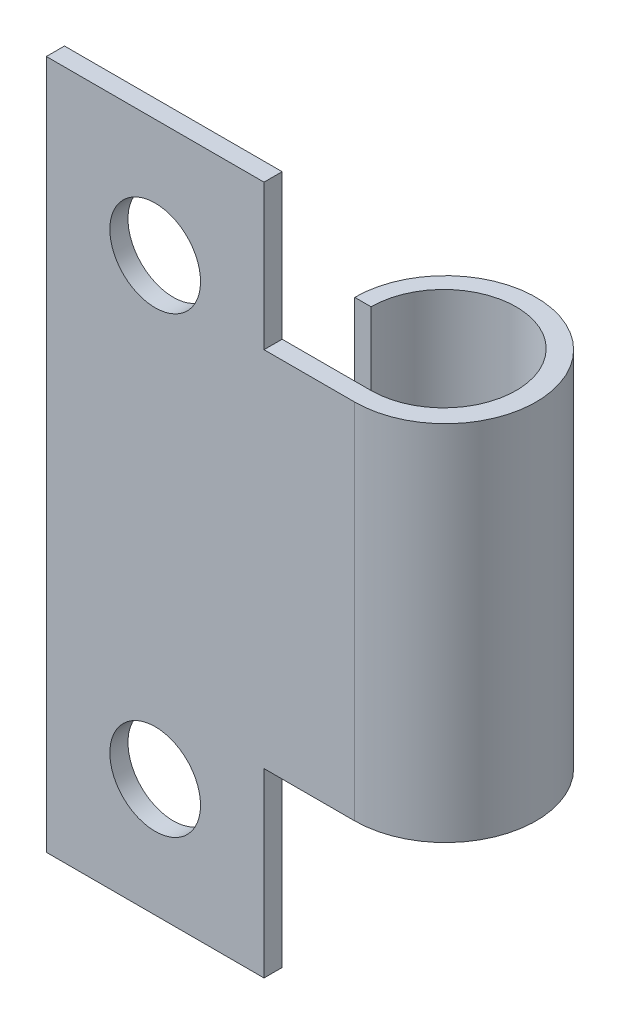
ISO-10303-21;
HEADER;
FILE_DESCRIPTION(('STEP AP214'),'2;1');
FILE_NAME('part.step','',(''),(''),'','','');
FILE_SCHEMA(('AUTOMOTIVE_DESIGN { 1 0 10303 214 1 1 1 1 }'));
ENDSEC;
DATA;
#1=APPLICATION_CONTEXT('core data for automotive mechanical design processes');
#2=APPLICATION_PROTOCOL_DEFINITION('international standard','automotive_design',2000,#1);
#3=PRODUCT_CONTEXT('',#1,'mechanical');
#4=PRODUCT('Part','Part','',(#3));
#5=PRODUCT_RELATED_PRODUCT_CATEGORY('part','',(#4));
#6=PRODUCT_DEFINITION_FORMATION('','',#4);
#7=PRODUCT_DEFINITION_CONTEXT('part definition',#1,'design');
#8=PRODUCT_DEFINITION('design','',#6,#7);
#9=PRODUCT_DEFINITION_SHAPE('','',#8);
#10=(LENGTH_UNIT() NAMED_UNIT(*) SI_UNIT(.MILLI.,.METRE.));
#11=(NAMED_UNIT(*) PLANE_ANGLE_UNIT() SI_UNIT($,.RADIAN.));
#12=(NAMED_UNIT(*) SI_UNIT($,.STERADIAN.) SOLID_ANGLE_UNIT());
#13=UNCERTAINTY_MEASURE_WITH_UNIT(LENGTH_MEASURE(1.E-05),#10,'distance_accuracy_value','');
#14=(GEOMETRIC_REPRESENTATION_CONTEXT(3) GLOBAL_UNCERTAINTY_ASSIGNED_CONTEXT((#13)) GLOBAL_UNIT_ASSIGNED_CONTEXT((#10,
#11,#12)) REPRESENTATION_CONTEXT('',''));
#15=CARTESIAN_POINT('',(0.,0.,0.));
#16=DIRECTION('',(0.,0.,1.));
#17=DIRECTION('',(1.,0.,0.));
#18=AXIS2_PLACEMENT_3D('',#15,#16,#17);
#19=CARTESIAN_POINT('',(12.,0.,1.));
#20=DIRECTION('',(-1.,0.,0.));
#21=DIRECTION('',(0.,0.,1.));
#22=AXIS2_PLACEMENT_3D('',#19,#20,#21);
#23=PLANE('',#22);
#24=DIRECTION('',(0.,0.,1.));
#25=VECTOR('',#24,1.);
#26=CARTESIAN_POINT('',(12.,10.,0.));
#27=LINE('',#26,#25);
#28=CARTESIAN_POINT('',(12.,10.,0.));
#29=VERTEX_POINT('',#28);
#30=CARTESIAN_POINT('',(12.,10.,1.));
#31=VERTEX_POINT('',#30);
#32=EDGE_CURVE('E123',#29,#31,#27,.T.);
#33=ORIENTED_EDGE('',*,*,#32,.T.);
#34=DIRECTION('',(0.,1.,0.));
#35=VECTOR('',#34,1.);
#36=CARTESIAN_POINT('',(12.,0.,1.));
#37=LINE('',#36,#35);
#38=CARTESIAN_POINT('',(12.,0.,1.));
#39=VERTEX_POINT('',#38);
#40=EDGE_CURVE('E173',#39,#31,#37,.T.);
#41=ORIENTED_EDGE('',*,*,#40,.F.);
#42=DIRECTION('',(0.,0.,-1.));
#43=VECTOR('',#42,1.);
#44=CARTESIAN_POINT('',(12.,0.,1.));
#45=LINE('',#44,#43);
#46=CARTESIAN_POINT('',(12.,0.,0.));
#47=VERTEX_POINT('',#46);
#48=EDGE_CURVE('E43',#39,#47,#45,.T.);
#49=ORIENTED_EDGE('',*,*,#48,.T.);
#50=DIRECTION('',(0.,1.,0.));
#51=VECTOR('',#50,1.);
#52=CARTESIAN_POINT('',(12.,0.,0.));
#53=LINE('',#52,#51);
#54=EDGE_CURVE('E142',#47,#29,#53,.T.);
#55=ORIENTED_EDGE('',*,*,#54,.T.);
#56=EDGE_LOOP('',(#33,#41,#49,#55));
#57=FACE_BOUND('',#56,.T.);
#58=ADVANCED_FACE('F35',(#57),#23,.F.);
#59=CARTESIAN_POINT('',(0.,0.,1.));
#60=DIRECTION('',(0.,0.,-1.));
#61=DIRECTION('',(-1.,0.,0.));
#62=AXIS2_PLACEMENT_3D('',#59,#60,#61);
#63=PLANE('',#62);
#64=DIRECTION('',(0.,-1.,0.));
#65=VECTOR('',#64,1.);
#66=CARTESIAN_POINT('',(0.,0.,1.));
#67=LINE('',#66,#65);
#68=CARTESIAN_POINT('',(0.,38.,1.));
#69=VERTEX_POINT('',#68);
#70=CARTESIAN_POINT('',(0.,0.,1.));
#71=VERTEX_POINT('',#70);
#72=EDGE_CURVE('E149',#69,#71,#67,.T.);
#73=ORIENTED_EDGE('',*,*,#72,.T.);
#74=DIRECTION('',(1.,0.,0.));
#75=VECTOR('',#74,1.);
#76=CARTESIAN_POINT('',(0.,0.,1.));
#77=LINE('',#76,#75);
#78=EDGE_CURVE('E87',#71,#39,#77,.T.);
#79=ORIENTED_EDGE('',*,*,#78,.T.);
#80=ORIENTED_EDGE('',*,*,#40,.T.);
#81=DIRECTION('',(1.,0.,0.));
#82=VECTOR('',#81,1.);
#83=CARTESIAN_POINT('',(12.,10.,1.));
#84=LINE('',#83,#82);
#85=CARTESIAN_POINT('',(17.,10.,1.));
#86=VERTEX_POINT('',#85);
#87=EDGE_CURVE('E131',#31,#86,#84,.T.);
#88=ORIENTED_EDGE('',*,*,#87,.T.);
#89=DIRECTION('',(0.,1.,0.));
#90=VECTOR('',#89,1.);
#91=CARTESIAN_POINT('',(17.,10.,1.));
#92=LINE('',#91,#90);
#93=CARTESIAN_POINT('',(17.,30.,1.));
#94=VERTEX_POINT('',#93);
#95=EDGE_CURVE('E186',#86,#94,#92,.T.);
#96=ORIENTED_EDGE('',*,*,#95,.T.);
#97=DIRECTION('',(1.,0.,0.));
#98=VECTOR('',#97,1.);
#99=CARTESIAN_POINT('',(12.,30.,1.));
#100=LINE('',#99,#98);
#101=CARTESIAN_POINT('',(12.,30.,1.));
#102=VERTEX_POINT('',#101);
#103=EDGE_CURVE('E201',#102,#94,#100,.T.);
#104=ORIENTED_EDGE('',*,*,#103,.F.);
#105=CARTESIAN_POINT('',(12.,38.,1.));
#106=VERTEX_POINT('',#105);
#107=EDGE_CURVE('E175',#102,#106,#37,.T.);
#108=ORIENTED_EDGE('',*,*,#107,.T.);
#109=DIRECTION('',(-1.,0.,0.));
#110=VECTOR('',#109,1.);
#111=CARTESIAN_POINT('',(0.,38.,1.));
#112=LINE('',#111,#110);
#113=EDGE_CURVE('E59',#106,#69,#112,.T.);
#114=ORIENTED_EDGE('',*,*,#113,.T.);
#115=EDGE_LOOP('',(#73,#79,#80,#88,#96,#104,#108,#114));
#116=FACE_BOUND('',#115,.T.);
#117=CARTESIAN_POINT('',(6.,31.5,1.));
#118=DIRECTION('',(0.,0.,1.));
#119=DIRECTION('',(1.,0.,0.));
#120=AXIS2_PLACEMENT_3D('',#117,#118,#119);
#121=CIRCLE('',#120,2.5);
#122=CARTESIAN_POINT('',(8.5,31.5,1.));
#123=VERTEX_POINT('',#122);
#124=EDGE_CURVE('E167',#123,#123,#121,.T.);
#125=ORIENTED_EDGE('',*,*,#124,.F.);
#126=EDGE_LOOP('',(#125));
#127=FACE_BOUND('',#126,.T.);
#128=CARTESIAN_POINT('',(6.,6.5,1.));
#129=DIRECTION('',(0.,0.,1.));
#130=DIRECTION('',(1.,0.,0.));
#131=AXIS2_PLACEMENT_3D('',#128,#129,#130);
#132=CIRCLE('',#131,2.5);
#133=CARTESIAN_POINT('',(8.5,6.5,1.));
#134=VERTEX_POINT('',#133);
#135=EDGE_CURVE('E179',#134,#134,#132,.T.);
#136=ORIENTED_EDGE('',*,*,#135,.F.);
#137=EDGE_LOOP('',(#136));
#138=FACE_BOUND('',#137,.T.);
#139=ADVANCED_FACE('F214',(#116,#127,#138),#63,.F.);
#140=CARTESIAN_POINT('',(0.,0.,0.));
#141=DIRECTION('',(0.,0.,-1.));
#142=DIRECTION('',(-1.,0.,0.));
#143=AXIS2_PLACEMENT_3D('',#140,#141,#142);
#144=PLANE('',#143);
#145=CARTESIAN_POINT('',(6.,31.5,0.));
#146=DIRECTION('',(0.,0.,1.));
#147=DIRECTION('',(1.,0.,0.));
#148=AXIS2_PLACEMENT_3D('',#145,#146,#147);
#149=CIRCLE('',#148,2.5);
#150=CARTESIAN_POINT('',(8.5,31.5,0.));
#151=VERTEX_POINT('',#150);
#152=EDGE_CURVE('E169',#151,#151,#149,.T.);
#153=ORIENTED_EDGE('',*,*,#152,.T.);
#154=EDGE_LOOP('',(#153));
#155=FACE_BOUND('',#154,.T.);
#156=DIRECTION('',(0.,-1.,0.));
#157=VECTOR('',#156,1.);
#158=CARTESIAN_POINT('',(0.,0.,0.));
#159=LINE('',#158,#157);
#160=CARTESIAN_POINT('',(0.,38.,0.));
#161=VERTEX_POINT('',#160);
#162=CARTESIAN_POINT('',(0.,0.,0.));
#163=VERTEX_POINT('',#162);
#164=EDGE_CURVE('E164',#161,#163,#159,.T.);
#165=ORIENTED_EDGE('',*,*,#164,.F.);
#166=DIRECTION('',(-1.,0.,0.));
#167=VECTOR('',#166,1.);
#168=CARTESIAN_POINT('',(0.,38.,0.));
#169=LINE('',#168,#167);
#170=CARTESIAN_POINT('',(12.,38.,0.));
#171=VERTEX_POINT('',#170);
#172=EDGE_CURVE('E80',#171,#161,#169,.T.);
#173=ORIENTED_EDGE('',*,*,#172,.F.);
#174=CARTESIAN_POINT('',(12.,30.,0.));
#175=VERTEX_POINT('',#174);
#176=EDGE_CURVE('E147',#175,#171,#53,.T.);
#177=ORIENTED_EDGE('',*,*,#176,.F.);
#178=DIRECTION('',(-1.,0.,0.));
#179=VECTOR('',#178,1.);
#180=CARTESIAN_POINT('',(16.9027685867457,30.,0.));
#181=LINE('',#180,#179);
#182=CARTESIAN_POINT('',(16.9027685867457,30.,0.));
#183=VERTEX_POINT('',#182);
#184=EDGE_CURVE('E50',#183,#175,#181,.T.);
#185=ORIENTED_EDGE('',*,*,#184,.F.);
#186=DIRECTION('',(0.,1.,0.));
#187=VECTOR('',#186,1.);
#188=CARTESIAN_POINT('',(16.9027685867457,10.,0.));
#189=LINE('',#188,#187);
#190=CARTESIAN_POINT('',(16.9027685867457,10.,0.));
#191=VERTEX_POINT('',#190);
#192=EDGE_CURVE('E143',#191,#183,#189,.T.);
#193=ORIENTED_EDGE('',*,*,#192,.F.);
#194=DIRECTION('',(-1.,0.,0.));
#195=VECTOR('',#194,1.);
#196=CARTESIAN_POINT('',(16.9027685867457,10.,0.));
#197=LINE('',#196,#195);
#198=EDGE_CURVE('E127',#191,#29,#197,.T.);
#199=ORIENTED_EDGE('',*,*,#198,.T.);
#200=ORIENTED_EDGE('',*,*,#54,.F.);
#201=DIRECTION('',(1.,0.,0.));
#202=VECTOR('',#201,1.);
#203=CARTESIAN_POINT('',(0.,0.,0.));
#204=LINE('',#203,#202);
#205=EDGE_CURVE('E151',#163,#47,#204,.T.);
#206=ORIENTED_EDGE('',*,*,#205,.F.);
#207=EDGE_LOOP('',(#165,#173,#177,#185,#193,#199,#200,#206));
#208=FACE_BOUND('',#207,.T.);
#209=CARTESIAN_POINT('',(6.,6.5,0.));
#210=DIRECTION('',(0.,0.,1.));
#211=DIRECTION('',(1.,0.,0.));
#212=AXIS2_PLACEMENT_3D('',#209,#210,#211);
#213=CIRCLE('',#212,2.5);
#214=CARTESIAN_POINT('',(8.5,6.5,0.));
#215=VERTEX_POINT('',#214);
#216=EDGE_CURVE('E181',#215,#215,#213,.T.);
#217=ORIENTED_EDGE('',*,*,#216,.T.);
#218=EDGE_LOOP('',(#217));
#219=FACE_BOUND('',#218,.T.);
#220=ADVANCED_FACE('F140',(#155,#208,#219),#144,.T.);
#221=CARTESIAN_POINT('',(0.,0.,1.));
#222=DIRECTION('',(1.,0.,0.));
#223=DIRECTION('',(0.,0.,-1.));
#224=AXIS2_PLACEMENT_3D('',#221,#222,#223);
#225=PLANE('',#224);
#226=ORIENTED_EDGE('',*,*,#164,.T.);
#227=DIRECTION('',(0.,0.,-1.));
#228=VECTOR('',#227,1.);
#229=CARTESIAN_POINT('',(0.,0.,1.));
#230=LINE('',#229,#228);
#231=EDGE_CURVE('E11',#71,#163,#230,.T.);
#232=ORIENTED_EDGE('',*,*,#231,.F.);
#233=ORIENTED_EDGE('',*,*,#72,.F.);
#234=DIRECTION('',(0.,0.,-1.));
#235=VECTOR('',#234,1.);
#236=CARTESIAN_POINT('',(0.,38.,1.));
#237=LINE('',#236,#235);
#238=EDGE_CURVE('E155',#69,#161,#237,.T.);
#239=ORIENTED_EDGE('',*,*,#238,.T.);
#240=EDGE_LOOP('',(#226,#232,#233,#239));
#241=FACE_BOUND('',#240,.T.);
#242=ADVANCED_FACE('F37',(#241),#225,.F.);
#243=CARTESIAN_POINT('',(0.,0.,1.));
#244=DIRECTION('',(0.,1.,0.));
#245=DIRECTION('',(0.,0.,1.));
#246=AXIS2_PLACEMENT_3D('',#243,#244,#245);
#247=PLANE('',#246);
#248=ORIENTED_EDGE('',*,*,#205,.T.);
#249=ORIENTED_EDGE('',*,*,#48,.F.);
#250=ORIENTED_EDGE('',*,*,#78,.F.);
#251=ORIENTED_EDGE('',*,*,#231,.T.);
#252=EDGE_LOOP('',(#248,#249,#250,#251));
#253=FACE_BOUND('',#252,.T.);
#254=ADVANCED_FACE('F218',(#253),#247,.F.);
#255=ORIENTED_EDGE('',*,*,#107,.F.);
#256=DIRECTION('',(0.,0.,1.));
#257=VECTOR('',#256,1.);
#258=CARTESIAN_POINT('',(12.,30.,0.));
#259=LINE('',#258,#257);
#260=EDGE_CURVE('E204',#175,#102,#259,.T.);
#261=ORIENTED_EDGE('',*,*,#260,.F.);
#262=ORIENTED_EDGE('',*,*,#176,.T.);
#263=DIRECTION('',(0.,0.,-1.));
#264=VECTOR('',#263,1.);
#265=CARTESIAN_POINT('',(12.,38.,1.));
#266=LINE('',#265,#264);
#267=EDGE_CURVE('E157',#106,#171,#266,.T.);
#268=ORIENTED_EDGE('',*,*,#267,.F.);
#269=EDGE_LOOP('',(#255,#261,#262,#268));
#270=FACE_BOUND('',#269,.T.);
#271=ADVANCED_FACE('F224',(#270),#23,.F.);
#272=CARTESIAN_POINT('',(0.,38.,1.));
#273=DIRECTION('',(0.,-1.,0.));
#274=DIRECTION('',(0.,0.,-1.));
#275=AXIS2_PLACEMENT_3D('',#272,#273,#274);
#276=PLANE('',#275);
#277=ORIENTED_EDGE('',*,*,#172,.T.);
#278=ORIENTED_EDGE('',*,*,#238,.F.);
#279=ORIENTED_EDGE('',*,*,#113,.F.);
#280=ORIENTED_EDGE('',*,*,#267,.T.);
#281=EDGE_LOOP('',(#277,#278,#279,#280));
#282=FACE_BOUND('',#281,.T.);
#283=ADVANCED_FACE('F159',(#282),#276,.F.);
#284=CARTESIAN_POINT('',(6.,31.5,1.));
#285=DIRECTION('',(0.,0.,-1.));
#286=DIRECTION('',(-1.,0.,0.));
#287=AXIS2_PLACEMENT_3D('',#284,#285,#286);
#288=CYLINDRICAL_SURFACE('',#287,2.5);
#289=ORIENTED_EDGE('',*,*,#124,.T.);
#290=EDGE_LOOP('',(#289));
#291=FACE_BOUND('',#290,.T.);
#292=ORIENTED_EDGE('',*,*,#152,.F.);
#293=EDGE_LOOP('',(#292));
#294=FACE_BOUND('',#293,.T.);
#295=ADVANCED_FACE('F238',(#291,#294),#288,.F.);
#296=CARTESIAN_POINT('',(6.,6.5,1.));
#297=DIRECTION('',(0.,0.,-1.));
#298=DIRECTION('',(-1.,0.,0.));
#299=AXIS2_PLACEMENT_3D('',#296,#297,#298);
#300=CYLINDRICAL_SURFACE('',#299,2.5);
#301=ORIENTED_EDGE('',*,*,#135,.T.);
#302=EDGE_LOOP('',(#301));
#303=FACE_BOUND('',#302,.T.);
#304=ORIENTED_EDGE('',*,*,#216,.F.);
#305=EDGE_LOOP('',(#304));
#306=FACE_BOUND('',#305,.T.);
#307=ADVANCED_FACE('F252',(#303,#306),#300,.F.);
#308=CARTESIAN_POINT('',(16.9027685867457,10.,-4.));
#309=DIRECTION('',(0.,1.,0.));
#310=DIRECTION('',(0.,0.,1.));
#311=AXIS2_PLACEMENT_3D('',#308,#309,#310);
#312=CYLINDRICAL_SURFACE('',#311,4.);
#313=CARTESIAN_POINT('',(16.9027685867457,30.,-4.));
#314=DIRECTION('',(0.,-1.,0.));
#315=DIRECTION('',(0.,0.,-1.));
#316=AXIS2_PLACEMENT_3D('',#313,#314,#315);
#317=CIRCLE('',#316,4.);
#318=CARTESIAN_POINT('',(12.9027685867457,30.,-4.));
#319=VERTEX_POINT('',#318);
#320=EDGE_CURVE('E144',#319,#183,#317,.T.);
#321=ORIENTED_EDGE('',*,*,#320,.F.);
#322=DIRECTION('',(0.,1.,0.));
#323=VECTOR('',#322,1.);
#324=CARTESIAN_POINT('',(12.9027685867457,10.,-4.));
#325=LINE('',#324,#323);
#326=CARTESIAN_POINT('',(12.9027685867457,10.,-4.));
#327=VERTEX_POINT('',#326);
#328=EDGE_CURVE('E191',#327,#319,#325,.T.);
#329=ORIENTED_EDGE('',*,*,#328,.F.);
#330=CARTESIAN_POINT('',(16.9027685867457,10.,-4.));
#331=DIRECTION('',(0.,-1.,0.));
#332=DIRECTION('',(0.,0.,-1.));
#333=AXIS2_PLACEMENT_3D('',#330,#331,#332);
#334=CIRCLE('',#333,4.);
#335=EDGE_CURVE('E189',#327,#191,#334,.T.);
#336=ORIENTED_EDGE('',*,*,#335,.T.);
#337=ORIENTED_EDGE('',*,*,#192,.T.);
#338=EDGE_LOOP('',(#321,#329,#336,#337));
#339=FACE_BOUND('',#338,.T.);
#340=ADVANCED_FACE('F248',(#339),#312,.F.);
#341=CARTESIAN_POINT('',(12.,10.,-4.));
#342=DIRECTION('',(0.,0.,1.));
#343=DIRECTION('',(1.,0.,0.));
#344=AXIS2_PLACEMENT_3D('',#341,#342,#343);
#345=PLANE('',#344);
#346=DIRECTION('',(1.,0.,0.));
#347=VECTOR('',#346,1.);
#348=CARTESIAN_POINT('',(12.,30.,-4.));
#349=LINE('',#348,#347);
#350=CARTESIAN_POINT('',(12.,30.,-4.));
#351=VERTEX_POINT('',#350);
#352=EDGE_CURVE('E195',#351,#319,#349,.T.);
#353=ORIENTED_EDGE('',*,*,#352,.F.);
#354=DIRECTION('',(0.,1.,0.));
#355=VECTOR('',#354,1.);
#356=CARTESIAN_POINT('',(12.,10.,-4.));
#357=LINE('',#356,#355);
#358=CARTESIAN_POINT('',(12.,10.,-4.));
#359=VERTEX_POINT('',#358);
#360=EDGE_CURVE('E188',#359,#351,#357,.T.);
#361=ORIENTED_EDGE('',*,*,#360,.F.);
#362=DIRECTION('',(1.,0.,0.));
#363=VECTOR('',#362,1.);
#364=CARTESIAN_POINT('',(12.,10.,-4.));
#365=LINE('',#364,#363);
#366=EDGE_CURVE('E208',#359,#327,#365,.T.);
#367=ORIENTED_EDGE('',*,*,#366,.T.);
#368=ORIENTED_EDGE('',*,*,#328,.T.);
#369=EDGE_LOOP('',(#353,#361,#367,#368));
#370=FACE_BOUND('',#369,.T.);
#371=ADVANCED_FACE('F251',(#370),#345,.T.);
#372=CARTESIAN_POINT('',(17.,10.,-4.));
#373=DIRECTION('',(0.,1.,0.));
#374=DIRECTION('',(0.,0.,1.));
#375=AXIS2_PLACEMENT_3D('',#372,#373,#374);
#376=CYLINDRICAL_SURFACE('',#375,5.);
#377=CARTESIAN_POINT('',(17.,30.,-4.));
#378=DIRECTION('',(0.,1.,0.));
#379=DIRECTION('',(0.,0.,1.));
#380=AXIS2_PLACEMENT_3D('',#377,#378,#379);
#381=CIRCLE('',#380,5.);
#382=EDGE_CURVE('E198',#94,#351,#381,.T.);
#383=ORIENTED_EDGE('',*,*,#382,.F.);
#384=ORIENTED_EDGE('',*,*,#95,.F.);
#385=CARTESIAN_POINT('',(17.,10.,-4.));
#386=DIRECTION('',(0.,1.,0.));
#387=DIRECTION('',(0.,0.,1.));
#388=AXIS2_PLACEMENT_3D('',#385,#386,#387);
#389=CIRCLE('',#388,5.);
#390=EDGE_CURVE('E211',#86,#359,#389,.T.);
#391=ORIENTED_EDGE('',*,*,#390,.T.);
#392=ORIENTED_EDGE('',*,*,#360,.T.);
#393=EDGE_LOOP('',(#383,#384,#391,#392));
#394=FACE_BOUND('',#393,.T.);
#395=ADVANCED_FACE('F245',(#394),#376,.T.);
#396=CARTESIAN_POINT('',(17.,10.,-4.));
#397=DIRECTION('',(0.,1.,0.));
#398=DIRECTION('',(0.,0.,1.));
#399=AXIS2_PLACEMENT_3D('',#396,#397,#398);
#400=PLANE('',#399);
#401=ORIENTED_EDGE('',*,*,#198,.F.);
#402=ORIENTED_EDGE('',*,*,#335,.F.);
#403=ORIENTED_EDGE('',*,*,#366,.F.);
#404=ORIENTED_EDGE('',*,*,#390,.F.);
#405=ORIENTED_EDGE('',*,*,#87,.F.);
#406=ORIENTED_EDGE('',*,*,#32,.F.);
#407=EDGE_LOOP('',(#401,#402,#403,#404,#405,#406));
#408=FACE_BOUND('',#407,.T.);
#409=ADVANCED_FACE('F125',(#408),#400,.F.);
#410=CARTESIAN_POINT('',(17.,30.,-4.));
#411=DIRECTION('',(0.,1.,0.));
#412=DIRECTION('',(0.,0.,1.));
#413=AXIS2_PLACEMENT_3D('',#410,#411,#412);
#414=PLANE('',#413);
#415=ORIENTED_EDGE('',*,*,#184,.T.);
#416=ORIENTED_EDGE('',*,*,#260,.T.);
#417=ORIENTED_EDGE('',*,*,#103,.T.);
#418=ORIENTED_EDGE('',*,*,#382,.T.);
#419=ORIENTED_EDGE('',*,*,#352,.T.);
#420=ORIENTED_EDGE('',*,*,#320,.T.);
#421=EDGE_LOOP('',(#415,#416,#417,#418,#419,#420));
#422=FACE_BOUND('',#421,.T.);
#423=ADVANCED_FACE('F239',(#422),#414,.T.);
#424=CLOSED_SHELL('',(#58,#139,#220,#242,#254,#271,#283,#295,#307,#340,#371,#395,#409,#423));
#425=MANIFOLD_SOLID_BREP('B2',#424);
#426=ADVANCED_BREP_SHAPE_REPRESENTATION('',(#18,#425),#14);
#427=SHAPE_DEFINITION_REPRESENTATION(#9,#426);
ENDSEC;
END-ISO-10303-21;
